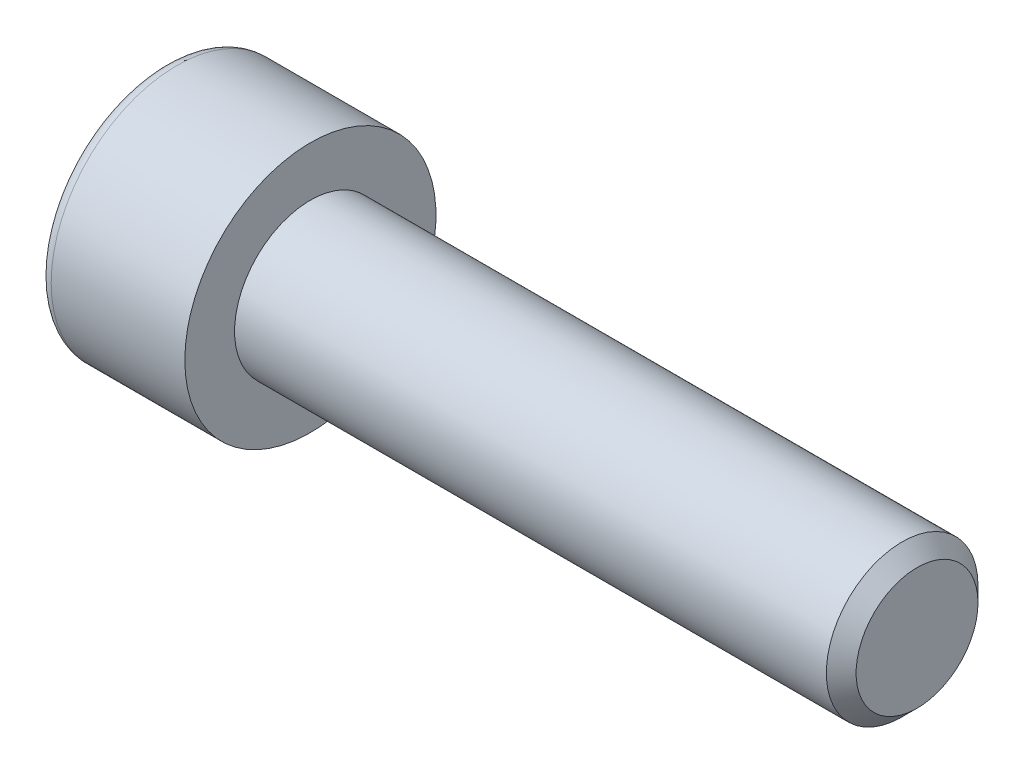
ISO-10303-21;
HEADER;
FILE_DESCRIPTION(('STEP AP214'),'2;1');
FILE_NAME('part.step','',(''),(''),'','','');
FILE_SCHEMA(('AUTOMOTIVE_DESIGN { 1 0 10303 214 1 1 1 1 }'));
ENDSEC;
DATA;
#1=APPLICATION_CONTEXT('core data for automotive mechanical design processes');
#2=APPLICATION_PROTOCOL_DEFINITION('international standard','automotive_design',2000,#1);
#3=PRODUCT_CONTEXT('',#1,'mechanical');
#4=PRODUCT('Part','Part','',(#3));
#5=PRODUCT_RELATED_PRODUCT_CATEGORY('part','',(#4));
#6=PRODUCT_DEFINITION_FORMATION('','',#4);
#7=PRODUCT_DEFINITION_CONTEXT('part definition',#1,'design');
#8=PRODUCT_DEFINITION('design','',#6,#7);
#9=PRODUCT_DEFINITION_SHAPE('','',#8);
#10=(LENGTH_UNIT() NAMED_UNIT(*) SI_UNIT(.MILLI.,.METRE.));
#11=(NAMED_UNIT(*) PLANE_ANGLE_UNIT() SI_UNIT($,.RADIAN.));
#12=(NAMED_UNIT(*) SI_UNIT($,.STERADIAN.) SOLID_ANGLE_UNIT());
#13=UNCERTAINTY_MEASURE_WITH_UNIT(LENGTH_MEASURE(1.E-05),#10,'distance_accuracy_value','');
#14=(GEOMETRIC_REPRESENTATION_CONTEXT(3) GLOBAL_UNCERTAINTY_ASSIGNED_CONTEXT((#13)) GLOBAL_UNIT_ASSIGNED_CONTEXT((#10,
#11,#12)) REPRESENTATION_CONTEXT('',''));
#15=CARTESIAN_POINT('',(0.,0.,0.));
#16=DIRECTION('',(0.,0.,1.));
#17=DIRECTION('',(1.,0.,0.));
#18=AXIS2_PLACEMENT_3D('',#15,#16,#17);
#19=CARTESIAN_POINT('',(0.,0.,0.));
#20=DIRECTION('',(-1.,0.,0.));
#21=DIRECTION('',(0.,0.,1.));
#22=AXIS2_PLACEMENT_3D('',#19,#20,#21);
#23=CYLINDRICAL_SURFACE('',#22,4.14);
#24=CARTESIAN_POINT('',(-4.406,0.,0.));
#25=DIRECTION('',(-1.,0.,0.));
#26=DIRECTION('',(0.,0.,1.));
#27=AXIS2_PLACEMENT_3D('',#24,#25,#26);
#28=CIRCLE('',#27,4.14);
#29=CARTESIAN_POINT('',(-4.406,0.,4.14));
#30=VERTEX_POINT('',#29);
#31=EDGE_CURVE('E11',#30,#30,#28,.F.);
#32=ORIENTED_EDGE('',*,*,#31,.T.);
#33=EDGE_LOOP('',(#32));
#34=FACE_BOUND('',#33,.T.);
#35=CARTESIAN_POINT('',(0.,0.,0.));
#36=DIRECTION('',(-1.,0.,0.));
#37=DIRECTION('',(0.,0.,1.));
#38=AXIS2_PLACEMENT_3D('',#35,#36,#37);
#39=CIRCLE('',#38,4.14);
#40=CARTESIAN_POINT('',(0.,0.,4.14));
#41=VERTEX_POINT('',#40);
#42=EDGE_CURVE('E143',#41,#41,#39,.T.);
#43=ORIENTED_EDGE('',*,*,#42,.T.);
#44=EDGE_LOOP('',(#43));
#45=FACE_BOUND('',#44,.T.);
#46=ADVANCED_FACE('F33',(#34,#45),#23,.T.);
#47=CARTESIAN_POINT('',(0.,4.14,0.));
#48=DIRECTION('',(1.,0.,0.));
#49=DIRECTION('',(0.,0.,-1.));
#50=AXIS2_PLACEMENT_3D('',#47,#48,#49);
#51=PLANE('',#50);
#52=CARTESIAN_POINT('',(0.,0.,0.));
#53=DIRECTION('',(1.,0.,0.));
#54=DIRECTION('',(0.,0.,-1.));
#55=AXIS2_PLACEMENT_3D('',#52,#53,#54);
#56=CIRCLE('',#55,2.5);
#57=CARTESIAN_POINT('',(0.,0.,-2.5));
#58=VERTEX_POINT('',#57);
#59=EDGE_CURVE('E135',#58,#58,#56,.T.);
#60=ORIENTED_EDGE('',*,*,#59,.F.);
#61=EDGE_LOOP('',(#60));
#62=FACE_BOUND('',#61,.T.);
#63=ORIENTED_EDGE('',*,*,#42,.F.);
#64=EDGE_LOOP('',(#63));
#65=FACE_BOUND('',#64,.T.);
#66=ADVANCED_FACE('F166',(#62,#65),#51,.T.);
#67=CARTESIAN_POINT('',(-4.82,0.,0.));
#68=DIRECTION('',(-1.,0.,0.));
#69=DIRECTION('',(0.,0.,1.));
#70=AXIS2_PLACEMENT_3D('',#67,#68,#69);
#71=PLANE('',#70);
#72=CARTESIAN_POINT('',(-4.82,0.,0.));
#73=DIRECTION('',(-1.,0.,0.));
#74=DIRECTION('',(0.,0.,1.));
#75=AXIS2_PLACEMENT_3D('',#72,#73,#74);
#76=CIRCLE('',#75,3.726);
#77=CARTESIAN_POINT('',(-4.82,0.,3.726));
#78=VERTEX_POINT('',#77);
#79=EDGE_CURVE('E41',#78,#78,#76,.T.);
#80=ORIENTED_EDGE('',*,*,#79,.T.);
#81=EDGE_LOOP('',(#80));
#82=FACE_BOUND('',#81,.T.);
#83=DIRECTION('',(0.,-1.,0.));
#84=VECTOR('',#83,1.);
#85=CARTESIAN_POINT('',(-4.82,1.15470053837925,-2.));
#86=LINE('',#85,#84);
#87=CARTESIAN_POINT('',(-4.82,1.15470053837925,-2.));
#88=VERTEX_POINT('',#87);
#89=CARTESIAN_POINT('',(-4.82,-1.15470053837925,-2.));
#90=VERTEX_POINT('',#89);
#91=EDGE_CURVE('E48',#88,#90,#86,.T.);
#92=ORIENTED_EDGE('',*,*,#91,.F.);
#93=DIRECTION('',(0.,-0.500000000000001,-0.866025403784438));
#94=VECTOR('',#93,1.);
#95=CARTESIAN_POINT('',(-4.82,2.30940107675851,0.));
#96=LINE('',#95,#94);
#97=CARTESIAN_POINT('',(-4.82,2.30940107675851,0.));
#98=VERTEX_POINT('',#97);
#99=EDGE_CURVE('E131',#98,#88,#96,.T.);
#100=ORIENTED_EDGE('',*,*,#99,.F.);
#101=DIRECTION('',(0.,0.500000000000001,-0.866025403784438));
#102=VECTOR('',#101,1.);
#103=CARTESIAN_POINT('',(-4.82,1.15470053837925,2.));
#104=LINE('',#103,#102);
#105=CARTESIAN_POINT('',(-4.82,1.15470053837925,2.));
#106=VERTEX_POINT('',#105);
#107=EDGE_CURVE('E129',#106,#98,#104,.T.);
#108=ORIENTED_EDGE('',*,*,#107,.F.);
#109=DIRECTION('',(0.,1.,0.));
#110=VECTOR('',#109,1.);
#111=CARTESIAN_POINT('',(-4.82,-1.15470053837925,2.));
#112=LINE('',#111,#110);
#113=CARTESIAN_POINT('',(-4.82,-1.15470053837925,2.));
#114=VERTEX_POINT('',#113);
#115=EDGE_CURVE('E96',#114,#106,#112,.T.);
#116=ORIENTED_EDGE('',*,*,#115,.F.);
#117=DIRECTION('',(0.,0.500000000000001,0.866025403784438));
#118=VECTOR('',#117,1.);
#119=CARTESIAN_POINT('',(-4.82,-2.30940107675851,0.));
#120=LINE('',#119,#118);
#121=CARTESIAN_POINT('',(-4.82,-2.30940107675851,0.));
#122=VERTEX_POINT('',#121);
#123=EDGE_CURVE('E125',#122,#114,#120,.T.);
#124=ORIENTED_EDGE('',*,*,#123,.F.);
#125=DIRECTION('',(0.,-0.500000000000001,0.866025403784438));
#126=VECTOR('',#125,1.);
#127=CARTESIAN_POINT('',(-4.82,-1.15470053837925,-2.));
#128=LINE('',#127,#126);
#129=EDGE_CURVE('E122',#90,#122,#128,.T.);
#130=ORIENTED_EDGE('',*,*,#129,.F.);
#131=EDGE_LOOP('',(#92,#100,#108,#116,#124,#130));
#132=FACE_BOUND('',#131,.T.);
#133=ADVANCED_FACE('F154',(#82,#132),#71,.T.);
#134=CARTESIAN_POINT('',(20.,0.,0.));
#135=DIRECTION('',(-1.,0.,0.));
#136=DIRECTION('',(0.,0.,1.));
#137=AXIS2_PLACEMENT_3D('',#134,#135,#136);
#138=CYLINDRICAL_SURFACE('',#137,2.5);
#139=CARTESIAN_POINT('',(19.5095,0.,0.));
#140=DIRECTION('',(1.,0.,0.));
#141=DIRECTION('',(0.,0.,-1.));
#142=AXIS2_PLACEMENT_3D('',#139,#140,#141);
#143=CIRCLE('',#142,2.5);
#144=CARTESIAN_POINT('',(19.5095,0.,-2.5));
#145=VERTEX_POINT('',#144);
#146=EDGE_CURVE('E149',#145,#145,#143,.F.);
#147=ORIENTED_EDGE('',*,*,#146,.T.);
#148=EDGE_LOOP('',(#147));
#149=FACE_BOUND('',#148,.T.);
#150=ORIENTED_EDGE('',*,*,#59,.T.);
#151=EDGE_LOOP('',(#150));
#152=FACE_BOUND('',#151,.T.);
#153=ADVANCED_FACE('F178',(#149,#152),#138,.T.);
#154=CARTESIAN_POINT('',(20.,0.,0.));
#155=DIRECTION('',(1.,0.,0.));
#156=DIRECTION('',(0.,0.,-1.));
#157=AXIS2_PLACEMENT_3D('',#154,#155,#156);
#158=PLANE('',#157);
#159=CARTESIAN_POINT('',(20.,0.,0.));
#160=DIRECTION('',(1.,0.,0.));
#161=DIRECTION('',(0.,0.,-1.));
#162=AXIS2_PLACEMENT_3D('',#159,#160,#161);
#163=CIRCLE('',#162,2.0095);
#164=CARTESIAN_POINT('',(20.,0.,-2.0095));
#165=VERTEX_POINT('',#164);
#166=EDGE_CURVE('E146',#165,#165,#163,.T.);
#167=ORIENTED_EDGE('',*,*,#166,.T.);
#168=EDGE_LOOP('',(#167));
#169=FACE_BOUND('',#168,.T.);
#170=ADVANCED_FACE('F181',(#169),#158,.T.);
#171=CARTESIAN_POINT('',(-2.32,1.15470053837925,-2.));
#172=DIRECTION('',(0.,0.,-1.));
#173=DIRECTION('',(-1.,0.,0.));
#174=AXIS2_PLACEMENT_3D('',#171,#172,#173);
#175=PLANE('',#174);
#176=ORIENTED_EDGE('',*,*,#91,.T.);
#177=DIRECTION('',(-1.,0.,0.));
#178=VECTOR('',#177,1.);
#179=CARTESIAN_POINT('',(-2.32,-1.15470053837925,-2.));
#180=LINE('',#179,#178);
#181=CARTESIAN_POINT('',(-2.32,-1.15470053837925,-2.));
#182=VERTEX_POINT('',#181);
#183=EDGE_CURVE('E78',#182,#90,#180,.T.);
#184=ORIENTED_EDGE('',*,*,#183,.F.);
#185=DIRECTION('',(0.,-1.,0.));
#186=VECTOR('',#185,1.);
#187=CARTESIAN_POINT('',(-2.32,1.15470053837925,-2.));
#188=LINE('',#187,#186);
#189=CARTESIAN_POINT('',(-2.32,1.15470053837925,-2.));
#190=VERTEX_POINT('',#189);
#191=EDGE_CURVE('E133',#190,#182,#188,.T.);
#192=ORIENTED_EDGE('',*,*,#191,.F.);
#193=DIRECTION('',(-1.,0.,0.));
#194=VECTOR('',#193,1.);
#195=CARTESIAN_POINT('',(-2.32,1.15470053837925,-2.));
#196=LINE('',#195,#194);
#197=EDGE_CURVE('E56',#190,#88,#196,.T.);
#198=ORIENTED_EDGE('',*,*,#197,.T.);
#199=EDGE_LOOP('',(#176,#184,#192,#198));
#200=FACE_BOUND('',#199,.T.);
#201=ADVANCED_FACE('F185',(#200),#175,.F.);
#202=CARTESIAN_POINT('',(-2.32,2.30940107675851,0.));
#203=DIRECTION('',(0.,0.866025403784438,-0.500000000000001));
#204=DIRECTION('',(0.,0.500000000000001,0.866025403784438));
#205=AXIS2_PLACEMENT_3D('',#202,#203,#204);
#206=PLANE('',#205);
#207=ORIENTED_EDGE('',*,*,#99,.T.);
#208=ORIENTED_EDGE('',*,*,#197,.F.);
#209=DIRECTION('',(0.,-0.500000000000001,-0.866025403784438));
#210=VECTOR('',#209,1.);
#211=CARTESIAN_POINT('',(-2.32,2.30940107675851,0.));
#212=LINE('',#211,#210);
#213=CARTESIAN_POINT('',(-2.32,2.30940107675851,0.));
#214=VERTEX_POINT('',#213);
#215=EDGE_CURVE('E108',#214,#190,#212,.T.);
#216=ORIENTED_EDGE('',*,*,#215,.F.);
#217=DIRECTION('',(-1.,0.,0.));
#218=VECTOR('',#217,1.);
#219=CARTESIAN_POINT('',(-2.32,2.30940107675851,0.));
#220=LINE('',#219,#218);
#221=EDGE_CURVE('E100',#214,#98,#220,.T.);
#222=ORIENTED_EDGE('',*,*,#221,.T.);
#223=EDGE_LOOP('',(#207,#208,#216,#222));
#224=FACE_BOUND('',#223,.T.);
#225=ADVANCED_FACE('F189',(#224),#206,.F.);
#226=CARTESIAN_POINT('',(-2.32,1.15470053837925,2.));
#227=DIRECTION('',(0.,0.866025403784438,0.5));
#228=DIRECTION('',(0.,-0.500000000000001,0.866025403784438));
#229=AXIS2_PLACEMENT_3D('',#226,#227,#228);
#230=PLANE('',#229);
#231=ORIENTED_EDGE('',*,*,#107,.T.);
#232=ORIENTED_EDGE('',*,*,#221,.F.);
#233=DIRECTION('',(0.,0.500000000000001,-0.866025403784438));
#234=VECTOR('',#233,1.);
#235=CARTESIAN_POINT('',(-2.32,1.15470053837925,2.));
#236=LINE('',#235,#234);
#237=CARTESIAN_POINT('',(-2.32,1.15470053837925,2.));
#238=VERTEX_POINT('',#237);
#239=EDGE_CURVE('E104',#238,#214,#236,.T.);
#240=ORIENTED_EDGE('',*,*,#239,.F.);
#241=DIRECTION('',(-1.,0.,0.));
#242=VECTOR('',#241,1.);
#243=CARTESIAN_POINT('',(-2.32,1.15470053837925,2.));
#244=LINE('',#243,#242);
#245=EDGE_CURVE('E89',#238,#106,#244,.T.);
#246=ORIENTED_EDGE('',*,*,#245,.T.);
#247=EDGE_LOOP('',(#231,#232,#240,#246));
#248=FACE_BOUND('',#247,.T.);
#249=ADVANCED_FACE('F105',(#248),#230,.F.);
#250=CARTESIAN_POINT('',(-2.32,-1.15470053837925,2.));
#251=DIRECTION('',(0.,0.,1.));
#252=DIRECTION('',(1.,0.,0.));
#253=AXIS2_PLACEMENT_3D('',#250,#251,#252);
#254=PLANE('',#253);
#255=ORIENTED_EDGE('',*,*,#115,.T.);
#256=ORIENTED_EDGE('',*,*,#245,.F.);
#257=DIRECTION('',(0.,1.,0.));
#258=VECTOR('',#257,1.);
#259=CARTESIAN_POINT('',(-2.32,-1.15470053837925,2.));
#260=LINE('',#259,#258);
#261=CARTESIAN_POINT('',(-2.32,-1.15470053837925,2.));
#262=VERTEX_POINT('',#261);
#263=EDGE_CURVE('E93',#262,#238,#260,.T.);
#264=ORIENTED_EDGE('',*,*,#263,.F.);
#265=DIRECTION('',(-1.,0.,0.));
#266=VECTOR('',#265,1.);
#267=CARTESIAN_POINT('',(-2.32,-1.15470053837925,2.));
#268=LINE('',#267,#266);
#269=EDGE_CURVE('E101',#262,#114,#268,.T.);
#270=ORIENTED_EDGE('',*,*,#269,.T.);
#271=EDGE_LOOP('',(#255,#256,#264,#270));
#272=FACE_BOUND('',#271,.T.);
#273=ADVANCED_FACE('F91',(#272),#254,.F.);
#274=CARTESIAN_POINT('',(-2.32,-2.30940107675851,0.));
#275=DIRECTION('',(0.,-0.866025403784438,0.500000000000001));
#276=DIRECTION('',(0.,-0.500000000000001,-0.866025403784438));
#277=AXIS2_PLACEMENT_3D('',#274,#275,#276);
#278=PLANE('',#277);
#279=ORIENTED_EDGE('',*,*,#123,.T.);
#280=ORIENTED_EDGE('',*,*,#269,.F.);
#281=DIRECTION('',(0.,0.500000000000001,0.866025403784438));
#282=VECTOR('',#281,1.);
#283=CARTESIAN_POINT('',(-2.32,-2.30940107675851,0.));
#284=LINE('',#283,#282);
#285=CARTESIAN_POINT('',(-2.32,-2.30940107675851,0.));
#286=VERTEX_POINT('',#285);
#287=EDGE_CURVE('E114',#286,#262,#284,.T.);
#288=ORIENTED_EDGE('',*,*,#287,.F.);
#289=DIRECTION('',(-1.,0.,0.));
#290=VECTOR('',#289,1.);
#291=CARTESIAN_POINT('',(-2.32,-2.30940107675851,0.));
#292=LINE('',#291,#290);
#293=EDGE_CURVE('E138',#286,#122,#292,.T.);
#294=ORIENTED_EDGE('',*,*,#293,.T.);
#295=EDGE_LOOP('',(#279,#280,#288,#294));
#296=FACE_BOUND('',#295,.T.);
#297=ADVANCED_FACE('F193',(#296),#278,.F.);
#298=CARTESIAN_POINT('',(-2.32,-1.15470053837925,-2.));
#299=DIRECTION('',(0.,-0.866025403784438,-0.500000000000001));
#300=DIRECTION('',(0.,0.500000000000001,-0.866025403784438));
#301=AXIS2_PLACEMENT_3D('',#298,#299,#300);
#302=PLANE('',#301);
#303=ORIENTED_EDGE('',*,*,#129,.T.);
#304=ORIENTED_EDGE('',*,*,#293,.F.);
#305=DIRECTION('',(0.,-0.500000000000001,0.866025403784438));
#306=VECTOR('',#305,1.);
#307=CARTESIAN_POINT('',(-2.32,-1.15470053837925,-2.));
#308=LINE('',#307,#306);
#309=EDGE_CURVE('E116',#182,#286,#308,.T.);
#310=ORIENTED_EDGE('',*,*,#309,.F.);
#311=ORIENTED_EDGE('',*,*,#183,.T.);
#312=EDGE_LOOP('',(#303,#304,#310,#311));
#313=FACE_BOUND('',#312,.T.);
#314=ADVANCED_FACE('F190',(#313),#302,.F.);
#315=CARTESIAN_POINT('',(-2.32,0.,0.));
#316=DIRECTION('',(-1.,0.,0.));
#317=DIRECTION('',(0.,0.,1.));
#318=AXIS2_PLACEMENT_3D('',#315,#316,#317);
#319=PLANE('',#318);
#320=ORIENTED_EDGE('',*,*,#191,.T.);
#321=ORIENTED_EDGE('',*,*,#309,.T.);
#322=ORIENTED_EDGE('',*,*,#287,.T.);
#323=ORIENTED_EDGE('',*,*,#263,.T.);
#324=ORIENTED_EDGE('',*,*,#239,.T.);
#325=ORIENTED_EDGE('',*,*,#215,.T.);
#326=EDGE_LOOP('',(#320,#321,#322,#323,#324,#325));
#327=FACE_BOUND('',#326,.T.);
#328=ADVANCED_FACE('F111',(#327),#319,.T.);
#329=CARTESIAN_POINT('',(20.,0.,0.));
#330=DIRECTION('',(-1.,0.,0.));
#331=DIRECTION('',(0.,0.,1.));
#332=AXIS2_PLACEMENT_3D('',#329,#330,#331);
#333=CONICAL_SURFACE('',#332,2.0095,0.78539816339745);
#334=ORIENTED_EDGE('',*,*,#146,.F.);
#335=EDGE_LOOP('',(#334));
#336=FACE_BOUND('',#335,.T.);
#337=ORIENTED_EDGE('',*,*,#166,.F.);
#338=EDGE_LOOP('',(#337));
#339=FACE_BOUND('',#338,.T.);
#340=ADVANCED_FACE('F158',(#336,#339),#333,.T.);
#341=CARTESIAN_POINT('',(-4.406,0.,0.));
#342=DIRECTION('',(-1.,0.,0.));
#343=DIRECTION('',(0.,0.,1.));
#344=AXIS2_PLACEMENT_3D('',#341,#342,#343);
#345=TOROIDAL_SURFACE('',#344,3.726,0.414);
#346=ORIENTED_EDGE('',*,*,#31,.F.);
#347=EDGE_LOOP('',(#346));
#348=FACE_BOUND('',#347,.T.);
#349=ORIENTED_EDGE('',*,*,#79,.F.);
#350=EDGE_LOOP('',(#349));
#351=FACE_BOUND('',#350,.T.);
#352=ADVANCED_FACE('F35',(#348,#351),#345,.T.);
#353=CLOSED_SHELL('',(#46,#66,#133,#153,#170,#201,#225,#249,#273,#297,#314,#328,#340,#352));
#354=MANIFOLD_SOLID_BREP('B2',#353);
#355=ADVANCED_BREP_SHAPE_REPRESENTATION('',(#18,#354),#14);
#356=SHAPE_DEFINITION_REPRESENTATION(#9,#355);
ENDSEC;
END-ISO-10303-21;
